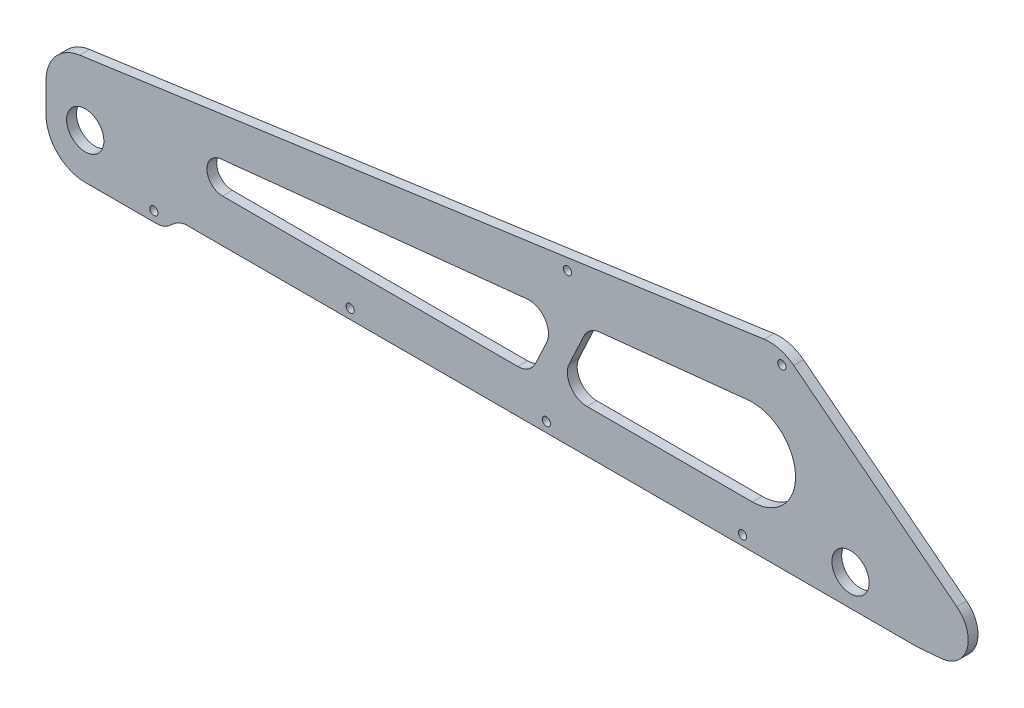
ISO-10303-21;
HEADER;
FILE_DESCRIPTION(('STEP AP214'),'2;1');
FILE_NAME('part.step','',(''),(''),'','','');
FILE_SCHEMA(('AUTOMOTIVE_DESIGN { 1 0 10303 214 1 1 1 1 }'));
ENDSEC;
DATA;
#1=APPLICATION_CONTEXT('core data for automotive mechanical design processes');
#2=APPLICATION_PROTOCOL_DEFINITION('international standard','automotive_design',2000,#1);
#3=PRODUCT_CONTEXT('',#1,'mechanical');
#4=PRODUCT('Part','Part','',(#3));
#5=PRODUCT_RELATED_PRODUCT_CATEGORY('part','',(#4));
#6=PRODUCT_DEFINITION_FORMATION('','',#4);
#7=PRODUCT_DEFINITION_CONTEXT('part definition',#1,'design');
#8=PRODUCT_DEFINITION('design','',#6,#7);
#9=PRODUCT_DEFINITION_SHAPE('','',#8);
#10=(LENGTH_UNIT() NAMED_UNIT(*) SI_UNIT(.MILLI.,.METRE.));
#11=(NAMED_UNIT(*) PLANE_ANGLE_UNIT() SI_UNIT($,.RADIAN.));
#12=(NAMED_UNIT(*) SI_UNIT($,.STERADIAN.) SOLID_ANGLE_UNIT());
#13=UNCERTAINTY_MEASURE_WITH_UNIT(LENGTH_MEASURE(1.E-05),#10,'distance_accuracy_value','');
#14=(GEOMETRIC_REPRESENTATION_CONTEXT(3) GLOBAL_UNCERTAINTY_ASSIGNED_CONTEXT((#13)) GLOBAL_UNIT_ASSIGNED_CONTEXT((#10,
#11,#12)) REPRESENTATION_CONTEXT('',''));
#15=CARTESIAN_POINT('',(0.,0.,0.));
#16=DIRECTION('',(0.,0.,1.));
#17=DIRECTION('',(1.,0.,0.));
#18=AXIS2_PLACEMENT_3D('',#15,#16,#17);
#19=CARTESIAN_POINT('',(-390.,12.,0.));
#20=DIRECTION('',(0.,0.,1.));
#21=DIRECTION('',(1.,0.,0.));
#22=AXIS2_PLACEMENT_3D('',#19,#20,#21);
#23=PLANE('',#22);
#24=CARTESIAN_POINT('',(-155.,-11.,0.));
#25=DIRECTION('',(0.,0.,-1.));
#26=DIRECTION('',(-1.,0.,0.));
#27=AXIS2_PLACEMENT_3D('',#24,#25,#26);
#28=CIRCLE('',#27,2.09999999999999);
#29=CARTESIAN_POINT('',(-157.1,-11.,0.));
#30=VERTEX_POINT('',#29);
#31=EDGE_CURVE('E326',#30,#30,#28,.F.);
#32=ORIENTED_EDGE('',*,*,#31,.T.);
#33=EDGE_LOOP('',(#32));
#34=FACE_BOUND('',#33,.T.);
#35=CARTESIAN_POINT('',(-355.,-18.,0.));
#36=DIRECTION('',(0.,0.,-1.));
#37=DIRECTION('',(-1.,0.,0.));
#38=AXIS2_PLACEMENT_3D('',#35,#36,#37);
#39=CIRCLE('',#38,2.09999999999999);
#40=CARTESIAN_POINT('',(-357.1,-18.,0.));
#41=VERTEX_POINT('',#40);
#42=EDGE_CURVE('E359',#41,#41,#39,.F.);
#43=ORIENTED_EDGE('',*,*,#42,.T.);
#44=EDGE_LOOP('',(#43));
#45=FACE_BOUND('',#44,.T.);
#46=CARTESIAN_POINT('',(-35.,74.,0.));
#47=DIRECTION('',(0.,0.,-1.));
#48=DIRECTION('',(-1.,0.,0.));
#49=AXIS2_PLACEMENT_3D('',#46,#47,#48);
#50=CIRCLE('',#49,2.1);
#51=CARTESIAN_POINT('',(-37.1,74.,0.));
#52=VERTEX_POINT('',#51);
#53=EDGE_CURVE('E329',#52,#52,#50,.F.);
#54=ORIENTED_EDGE('',*,*,#53,.T.);
#55=EDGE_LOOP('',(#54));
#56=FACE_BOUND('',#55,.T.);
#57=CARTESIAN_POINT('',(-390.,0.,0.));
#58=DIRECTION('',(0.,0.,-1.));
#59=DIRECTION('',(-1.,0.,0.));
#60=AXIS2_PLACEMENT_3D('',#57,#58,#59);
#61=CIRCLE('',#60,9.50000000000001);
#62=CARTESIAN_POINT('',(-399.5,0.,0.));
#63=VERTEX_POINT('',#62);
#64=EDGE_CURVE('E356',#63,#63,#61,.F.);
#65=ORIENTED_EDGE('',*,*,#64,.T.);
#66=EDGE_LOOP('',(#65));
#67=FACE_BOUND('',#66,.T.);
#68=CARTESIAN_POINT('',(-255.,-11.,0.));
#69=DIRECTION('',(0.,0.,-1.));
#70=DIRECTION('',(-1.,0.,0.));
#71=AXIS2_PLACEMENT_3D('',#68,#69,#70);
#72=CIRCLE('',#71,2.09999999999999);
#73=CARTESIAN_POINT('',(-257.1,-11.,0.));
#74=VERTEX_POINT('',#73);
#75=EDGE_CURVE('E332',#74,#74,#72,.F.);
#76=ORIENTED_EDGE('',*,*,#75,.T.);
#77=EDGE_LOOP('',(#76));
#78=FACE_BOUND('',#77,.T.);
#79=CARTESIAN_POINT('',(0.,0.,0.));
#80=DIRECTION('',(0.,0.,-1.));
#81=DIRECTION('',(-1.,0.,0.));
#82=AXIS2_PLACEMENT_3D('',#79,#80,#81);
#83=CIRCLE('',#82,9.5);
#84=CARTESIAN_POINT('',(-9.5,0.,0.));
#85=VERTEX_POINT('',#84);
#86=EDGE_CURVE('E353',#85,#85,#83,.F.);
#87=ORIENTED_EDGE('',*,*,#86,.T.);
#88=EDGE_LOOP('',(#87));
#89=FACE_BOUND('',#88,.T.);
#90=CARTESIAN_POINT('',(-144.229116997255,61.,0.));
#91=DIRECTION('',(0.,0.,-1.));
#92=DIRECTION('',(-1.,0.,0.));
#93=AXIS2_PLACEMENT_3D('',#90,#91,#92);
#94=CIRCLE('',#93,2.10000000000002);
#95=CARTESIAN_POINT('',(-146.329116997255,61.,0.));
#96=VERTEX_POINT('',#95);
#97=EDGE_CURVE('E207',#96,#96,#94,.F.);
#98=ORIENTED_EDGE('',*,*,#97,.T.);
#99=EDGE_LOOP('',(#98));
#100=FACE_BOUND('',#99,.T.);
#101=CARTESIAN_POINT('',(-55.,-11.,0.));
#102=DIRECTION('',(0.,0.,-1.));
#103=DIRECTION('',(-1.,0.,0.));
#104=AXIS2_PLACEMENT_3D('',#101,#102,#103);
#105=CIRCLE('',#104,2.1);
#106=CARTESIAN_POINT('',(-57.1,-11.,0.));
#107=VERTEX_POINT('',#106);
#108=EDGE_CURVE('E350',#107,#107,#105,.F.);
#109=ORIENTED_EDGE('',*,*,#108,.T.);
#110=EDGE_LOOP('',(#109));
#111=FACE_BOUND('',#110,.T.);
#112=DIRECTION('',(0.99026806874157,0.139173100960066,0.));
#113=VECTOR('',#112,1.);
#114=CARTESIAN_POINT('',(-44.0039791289545,80.8231210272953,0.));
#115=LINE('',#114,#113);
#116=CARTESIAN_POINT('',(-392.783462019201,31.8053613748314,0.));
#117=VERTEX_POINT('',#116);
#118=CARTESIAN_POINT('',(-44.0039791289545,80.8231210272953,0.));
#119=VERTEX_POINT('',#118);
#120=EDGE_CURVE('E204',#117,#119,#115,.T.);
#121=ORIENTED_EDGE('',*,*,#120,.T.);
#122=CARTESIAN_POINT('',(-41.2205171097532,61.017759652464,0.));
#123=DIRECTION('',(0.,0.,-1.));
#124=DIRECTION('',(-1.,0.,0.));
#125=AXIS2_PLACEMENT_3D('',#122,#123,#124);
#126=CIRCLE('',#125,20.);
#127=CARTESIAN_POINT('',(-28.90728760324,76.7779747245984,0.));
#128=VERTEX_POINT('',#127);
#129=EDGE_CURVE('E212',#128,#119,#126,.F.);
#130=ORIENTED_EDGE('',*,*,#129,.F.);
#131=DIRECTION('',(0.788010753606721,-0.615661475325659,0.));
#132=VECTOR('',#131,1.);
#133=CARTESIAN_POINT('',(54.2349221298849,11.8201613041008,0.));
#134=LINE('',#133,#132);
#135=CARTESIAN_POINT('',(54.2349221298849,11.8201613041008,0.));
#136=VERTEX_POINT('',#135);
#137=EDGE_CURVE('E209',#128,#136,#134,.T.);
#138=ORIENTED_EDGE('',*,*,#137,.T.);
#139=CARTESIAN_POINT('',(45.,0.,0.));
#140=DIRECTION('',(0.,0.,-1.));
#141=DIRECTION('',(-1.,0.,0.));
#142=AXIS2_PLACEMENT_3D('',#139,#140,#141);
#143=CIRCLE('',#142,15.);
#144=CARTESIAN_POINT('',(46.3073361412148,-14.9429204713762,0.));
#145=VERTEX_POINT('',#144);
#146=EDGE_CURVE('E217',#145,#136,#143,.F.);
#147=ORIENTED_EDGE('',*,*,#146,.F.);
#148=DIRECTION('',(-0.996194698091746,-0.0871557427476516,0.));
#149=VECTOR('',#148,1.);
#150=CARTESIAN_POINT('',(34.2248618408655,-16.,0.));
#151=LINE('',#150,#149);
#152=CARTESIAN_POINT('',(34.2248618408655,-16.,0.));
#153=VERTEX_POINT('',#152);
#154=EDGE_CURVE('E214',#145,#153,#151,.T.);
#155=ORIENTED_EDGE('',*,*,#154,.T.);
#156=DIRECTION('',(-1.,0.,0.));
#157=VECTOR('',#156,1.);
#158=CARTESIAN_POINT('',(34.2248618408655,-16.,0.));
#159=LINE('',#158,#157);
#160=CARTESIAN_POINT('',(-338.018022509179,-16.,0.));
#161=VERTEX_POINT('',#160);
#162=EDGE_CURVE('E221',#153,#161,#159,.T.);
#163=ORIENTED_EDGE('',*,*,#162,.T.);
#164=CARTESIAN_POINT('',(-338.018022509179,-26.,0.));
#165=DIRECTION('',(0.,0.,-1.));
#166=DIRECTION('',(-1.,0.,0.));
#167=AXIS2_PLACEMENT_3D('',#164,#165,#166);
#168=CIRCLE('',#167,10.);
#169=CARTESIAN_POINT('',(-344.445898606044,-18.3395555688103,0.));
#170=VERTEX_POINT('',#169);
#171=EDGE_CURVE('E341',#161,#170,#168,.F.);
#172=ORIENTED_EDGE('',*,*,#171,.T.);
#173=DIRECTION('',(-0.766044443118978,-0.64278760968654,0.));
#174=VECTOR('',#173,1.);
#175=CARTESIAN_POINT('',(-347.211826245797,-20.6604444311898,0.));
#176=LINE('',#175,#174);
#177=CARTESIAN_POINT('',(-347.211826245797,-20.6604444311898,0.));
#178=VERTEX_POINT('',#177);
#179=EDGE_CURVE('E227',#170,#178,#176,.T.);
#180=ORIENTED_EDGE('',*,*,#179,.T.);
#181=CARTESIAN_POINT('',(-353.639702342662,-13.,0.));
#182=DIRECTION('',(0.,0.,-1.));
#183=DIRECTION('',(-1.,0.,0.));
#184=AXIS2_PLACEMENT_3D('',#181,#182,#183);
#185=CIRCLE('',#184,10.);
#186=CARTESIAN_POINT('',(-353.639702342662,-23.,0.));
#187=VERTEX_POINT('',#186);
#188=EDGE_CURVE('E235',#187,#178,#185,.F.);
#189=ORIENTED_EDGE('',*,*,#188,.F.);
#190=DIRECTION('',(-1.,0.,0.));
#191=VECTOR('',#190,1.);
#192=CARTESIAN_POINT('',(-390.,-23.,0.));
#193=LINE('',#192,#191);
#194=CARTESIAN_POINT('',(-390.,-23.,0.));
#195=VERTEX_POINT('',#194);
#196=EDGE_CURVE('E232',#187,#195,#193,.T.);
#197=ORIENTED_EDGE('',*,*,#196,.T.);
#198=CARTESIAN_POINT('',(-390.,-3.,0.));
#199=DIRECTION('',(0.,0.,-1.));
#200=DIRECTION('',(-1.,0.,0.));
#201=AXIS2_PLACEMENT_3D('',#198,#199,#200);
#202=CIRCLE('',#201,20.);
#203=CARTESIAN_POINT('',(-410.,-3.,0.));
#204=VERTEX_POINT('',#203);
#205=EDGE_CURVE('E240',#204,#195,#202,.F.);
#206=ORIENTED_EDGE('',*,*,#205,.F.);
#207=DIRECTION('',(0.,1.,0.));
#208=VECTOR('',#207,1.);
#209=CARTESIAN_POINT('',(-410.,12.,0.));
#210=LINE('',#209,#208);
#211=CARTESIAN_POINT('',(-410.,12.,0.));
#212=VERTEX_POINT('',#211);
#213=EDGE_CURVE('E237',#204,#212,#210,.T.);
#214=ORIENTED_EDGE('',*,*,#213,.T.);
#215=CARTESIAN_POINT('',(-390.,12.,0.));
#216=DIRECTION('',(0.,0.,-1.));
#217=DIRECTION('',(-1.,0.,0.));
#218=AXIS2_PLACEMENT_3D('',#215,#216,#217);
#219=CIRCLE('',#218,20.);
#220=EDGE_CURVE('E348',#117,#212,#219,.F.);
#221=ORIENTED_EDGE('',*,*,#220,.F.);
#222=EDGE_LOOP('',(#121,#130,#138,#147,#155,#163,#172,#180,#189,#197,#206,#214,#221));
#223=FACE_BOUND('',#222,.T.);
#224=CARTESIAN_POINT('',(-320.,14.,0.));
#225=DIRECTION('',(0.,0.,1.));
#226=DIRECTION('',(1.,0.,0.));
#227=AXIS2_PLACEMENT_3D('',#224,#225,#226);
#228=CIRCLE('',#227,8.00000000000001);
#229=CARTESIAN_POINT('',(-320.827405056364,21.9570975155959,0.));
#230=VERTEX_POINT('',#229);
#231=CARTESIAN_POINT('',(-320.,5.99999999999996,0.));
#232=VERTEX_POINT('',#231);
#233=EDGE_CURVE('E189',#230,#232,#228,.T.);
#234=ORIENTED_EDGE('',*,*,#233,.T.);
#235=DIRECTION('',(1.,0.,0.));
#236=VECTOR('',#235,1.);
#237=CARTESIAN_POINT('',(-320.,5.99999999999996,0.));
#238=LINE('',#237,#236);
#239=CARTESIAN_POINT('',(-169.611237635625,5.99999999999996,0.));
#240=VERTEX_POINT('',#239);
#241=EDGE_CURVE('E242',#232,#240,#238,.T.);
#242=ORIENTED_EDGE('',*,*,#241,.T.);
#243=CARTESIAN_POINT('',(-169.611237635625,16.,0.));
#244=DIRECTION('',(0.,0.,1.));
#245=DIRECTION('',(1.,0.,0.));
#246=AXIS2_PLACEMENT_3D('',#243,#244,#245);
#247=CIRCLE('',#246,10.);
#248=CARTESIAN_POINT('',(-160.548159765258,11.773817382593,0.));
#249=VERTEX_POINT('',#248);
#250=EDGE_CURVE('E362',#240,#249,#247,.T.);
#251=ORIENTED_EDGE('',*,*,#250,.T.);
#252=DIRECTION('',(0.422618261740698,0.906307787036651,0.));
#253=VECTOR('',#252,1.);
#254=CARTESIAN_POINT('',(-160.548159765258,11.773817382593,0.));
#255=LINE('',#254,#253);
#256=CARTESIAN_POINT('',(-154.850047639105,23.9934582709677,0.));
#257=VERTEX_POINT('',#256);
#258=EDGE_CURVE('E246',#249,#257,#255,.T.);
#259=ORIENTED_EDGE('',*,*,#258,.T.);
#260=CARTESIAN_POINT('',(-163.913125509472,28.2196408883746,0.));
#261=DIRECTION('',(0.,0.,1.));
#262=DIRECTION('',(1.,0.,0.));
#263=AXIS2_PLACEMENT_3D('',#260,#261,#262);
#264=CIRCLE('',#263,9.99999999999998);
#265=CARTESIAN_POINT('',(-164.947381829927,38.1660127828695,0.));
#266=VERTEX_POINT('',#265);
#267=EDGE_CURVE('E249',#257,#266,#264,.T.);
#268=ORIENTED_EDGE('',*,*,#267,.T.);
#269=DIRECTION('',(-0.994637189449491,-0.103425632045529,0.));
#270=VECTOR('',#269,1.);
#271=CARTESIAN_POINT('',(-320.827405056364,21.9570975155959,0.));
#272=LINE('',#271,#270);
#273=EDGE_CURVE('E250',#266,#230,#272,.T.);
#274=ORIENTED_EDGE('',*,*,#273,.T.);
#275=EDGE_LOOP('',(#234,#242,#251,#259,#268,#274));
#276=FACE_BOUND('',#275,.T.);
#277=DIRECTION('',(1.,0.,0.));
#278=VECTOR('',#277,1.);
#279=CARTESIAN_POINT('',(-134.303144228825,5.99999999999996,0.));
#280=LINE('',#279,#278);
#281=CARTESIAN_POINT('',(-134.303144228825,5.99999999999997,0.));
#282=VERTEX_POINT('',#281);
#283=CARTESIAN_POINT('',(-50.,5.99999999999996,0.));
#284=VERTEX_POINT('',#283);
#285=EDGE_CURVE('E191',#282,#284,#280,.T.);
#286=ORIENTED_EDGE('',*,*,#285,.T.);
#287=CARTESIAN_POINT('',(-50.,28.,0.));
#288=DIRECTION('',(0.,0.,1.));
#289=DIRECTION('',(1.,0.,0.));
#290=AXIS2_PLACEMENT_3D('',#287,#288,#289);
#291=CIRCLE('',#290,22.);
#292=CARTESIAN_POINT('',(-52.2753639050016,49.8820181678887,0.));
#293=VERTEX_POINT('',#292);
#294=EDGE_CURVE('E182',#284,#293,#291,.T.);
#295=ORIENTED_EDGE('',*,*,#294,.T.);
#296=DIRECTION('',(-0.994637189449491,-0.103425632045529,0.));
#297=VECTOR('',#296,1.);
#298=CARTESIAN_POINT('',(-127.84001930833,42.0245578514115,0.));
#299=LINE('',#298,#297);
#300=CARTESIAN_POINT('',(-127.84001930833,42.0245578514115,0.));
#301=VERTEX_POINT('',#300);
#302=EDGE_CURVE('E253',#293,#301,#299,.T.);
#303=ORIENTED_EDGE('',*,*,#302,.T.);
#304=CARTESIAN_POINT('',(-126.805762987875,32.0781859569166,0.));
#305=DIRECTION('',(0.,0.,1.));
#306=DIRECTION('',(1.,0.,0.));
#307=AXIS2_PLACEMENT_3D('',#304,#305,#306);
#308=CIRCLE('',#307,10.);
#309=CARTESIAN_POINT('',(-135.868840858241,36.3043685743236,0.));
#310=VERTEX_POINT('',#309);
#311=EDGE_CURVE('E367',#301,#310,#308,.T.);
#312=ORIENTED_EDGE('',*,*,#311,.T.);
#313=DIRECTION('',(-0.422618261740698,-0.906307787036651,0.));
#314=VECTOR('',#313,1.);
#315=CARTESIAN_POINT('',(-143.366222099192,20.2261826174069,0.));
#316=LINE('',#315,#314);
#317=CARTESIAN_POINT('',(-143.366222099192,20.2261826174069,0.));
#318=VERTEX_POINT('',#317);
#319=EDGE_CURVE('E257',#310,#318,#316,.T.);
#320=ORIENTED_EDGE('',*,*,#319,.T.);
#321=CARTESIAN_POINT('',(-134.303144228825,16.,0.));
#322=DIRECTION('',(0.,0.,1.));
#323=DIRECTION('',(1.,0.,0.));
#324=AXIS2_PLACEMENT_3D('',#321,#322,#323);
#325=CIRCLE('',#324,9.99999999999999);
#326=EDGE_CURVE('E19',#318,#282,#325,.T.);
#327=ORIENTED_EDGE('',*,*,#326,.T.);
#328=EDGE_LOOP('',(#286,#295,#303,#312,#320,#327));
#329=FACE_BOUND('',#328,.T.);
#330=ADVANCED_FACE('F16',(#34,#45,#56,#67,#78,#89,#100,#111,#223,#276,#329),#23,.F.);
#331=CARTESIAN_POINT('',(-134.303144228825,5.99999999999996,0.));
#332=DIRECTION('',(0.,-1.,0.));
#333=DIRECTION('',(0.,0.,-1.));
#334=AXIS2_PLACEMENT_3D('',#331,#332,#333);
#335=PLANE('',#334);
#336=DIRECTION('',(0.,0.,-1.));
#337=VECTOR('',#336,1.);
#338=CARTESIAN_POINT('',(-50.,5.99999999999996,0.));
#339=LINE('',#338,#337);
#340=CARTESIAN_POINT('',(-50.,5.99999999999996,5.));
#341=VERTEX_POINT('',#340);
#342=EDGE_CURVE('E185',#284,#341,#339,.F.);
#343=ORIENTED_EDGE('',*,*,#342,.F.);
#344=ORIENTED_EDGE('',*,*,#285,.F.);
#345=DIRECTION('',(0.,0.,1.));
#346=VECTOR('',#345,1.);
#347=CARTESIAN_POINT('',(-134.303144228825,5.99999999999997,0.));
#348=LINE('',#347,#346);
#349=CARTESIAN_POINT('',(-134.303144228825,5.99999999999997,5.));
#350=VERTEX_POINT('',#349);
#351=EDGE_CURVE('E200',#282,#350,#348,.T.);
#352=ORIENTED_EDGE('',*,*,#351,.T.);
#353=DIRECTION('',(1.,0.,0.));
#354=VECTOR('',#353,1.);
#355=CARTESIAN_POINT('',(-390.,5.99999999999996,5.));
#356=LINE('',#355,#354);
#357=EDGE_CURVE('E197',#341,#350,#356,.F.);
#358=ORIENTED_EDGE('',*,*,#357,.F.);
#359=EDGE_LOOP('',(#343,#344,#352,#358));
#360=FACE_BOUND('',#359,.T.);
#361=ADVANCED_FACE('F195',(#360),#335,.F.);
#362=CARTESIAN_POINT('',(-134.303144228825,16.,0.));
#363=DIRECTION('',(0.,0.,1.));
#364=DIRECTION('',(1.,0.,0.));
#365=AXIS2_PLACEMENT_3D('',#362,#363,#364);
#366=CYLINDRICAL_SURFACE('',#365,9.99999999999999);
#367=ORIENTED_EDGE('',*,*,#351,.F.);
#368=ORIENTED_EDGE('',*,*,#326,.F.);
#369=DIRECTION('',(0.,0.,1.));
#370=VECTOR('',#369,1.);
#371=CARTESIAN_POINT('',(-143.366222099192,20.2261826174069,0.));
#372=LINE('',#371,#370);
#373=CARTESIAN_POINT('',(-143.366222099192,20.2261826174069,5.));
#374=VERTEX_POINT('',#373);
#375=EDGE_CURVE('E258',#318,#374,#372,.T.);
#376=ORIENTED_EDGE('',*,*,#375,.T.);
#377=CARTESIAN_POINT('',(-134.303144228825,16.,5.));
#378=DIRECTION('',(0.,0.,1.));
#379=DIRECTION('',(1.,0.,0.));
#380=AXIS2_PLACEMENT_3D('',#377,#378,#379);
#381=CIRCLE('',#380,9.99999999999999);
#382=EDGE_CURVE('E321',#350,#374,#381,.F.);
#383=ORIENTED_EDGE('',*,*,#382,.F.);
#384=EDGE_LOOP('',(#367,#368,#376,#383));
#385=FACE_BOUND('',#384,.T.);
#386=ADVANCED_FACE('F592',(#385),#366,.F.);
#387=CARTESIAN_POINT('',(-143.366222099192,20.2261826174069,0.));
#388=DIRECTION('',(-0.906307787036651,0.422618261740698,0.));
#389=DIRECTION('',(-0.422618261740698,-0.906307787036651,0.));
#390=AXIS2_PLACEMENT_3D('',#387,#388,#389);
#391=PLANE('',#390);
#392=ORIENTED_EDGE('',*,*,#375,.F.);
#393=ORIENTED_EDGE('',*,*,#319,.F.);
#394=DIRECTION('',(0.,0.,1.));
#395=VECTOR('',#394,1.);
#396=CARTESIAN_POINT('',(-135.868840858241,36.3043685743236,0.));
#397=LINE('',#396,#395);
#398=CARTESIAN_POINT('',(-135.868840858241,36.3043685743236,5.));
#399=VERTEX_POINT('',#398);
#400=EDGE_CURVE('E256',#310,#399,#397,.T.);
#401=ORIENTED_EDGE('',*,*,#400,.T.);
#402=DIRECTION('',(0.422618261740698,0.906307787036651,0.));
#403=VECTOR('',#402,1.);
#404=CARTESIAN_POINT('',(-143.366222099192,20.2261826174069,5.));
#405=LINE('',#404,#403);
#406=EDGE_CURVE('E320',#374,#399,#405,.T.);
#407=ORIENTED_EDGE('',*,*,#406,.F.);
#408=EDGE_LOOP('',(#392,#393,#401,#407));
#409=FACE_BOUND('',#408,.T.);
#410=ADVANCED_FACE('F588',(#409),#391,.F.);
#411=CARTESIAN_POINT('',(-126.805762987875,32.0781859569166,0.));
#412=DIRECTION('',(0.,0.,1.));
#413=DIRECTION('',(1.,0.,0.));
#414=AXIS2_PLACEMENT_3D('',#411,#412,#413);
#415=CYLINDRICAL_SURFACE('',#414,10.);
#416=ORIENTED_EDGE('',*,*,#400,.F.);
#417=ORIENTED_EDGE('',*,*,#311,.F.);
#418=DIRECTION('',(0.,0.,1.));
#419=VECTOR('',#418,1.);
#420=CARTESIAN_POINT('',(-127.84001930833,42.0245578514115,0.));
#421=LINE('',#420,#419);
#422=CARTESIAN_POINT('',(-127.84001930833,42.0245578514115,5.));
#423=VERTEX_POINT('',#422);
#424=EDGE_CURVE('E255',#301,#423,#421,.T.);
#425=ORIENTED_EDGE('',*,*,#424,.T.);
#426=CARTESIAN_POINT('',(-126.805762987875,32.0781859569166,5.));
#427=DIRECTION('',(0.,0.,1.));
#428=DIRECTION('',(1.,0.,0.));
#429=AXIS2_PLACEMENT_3D('',#426,#427,#428);
#430=CIRCLE('',#429,10.);
#431=EDGE_CURVE('E317',#399,#423,#430,.F.);
#432=ORIENTED_EDGE('',*,*,#431,.F.);
#433=EDGE_LOOP('',(#416,#417,#425,#432));
#434=FACE_BOUND('',#433,.T.);
#435=ADVANCED_FACE('F584',(#434),#415,.F.);
#436=CARTESIAN_POINT('',(-127.84001930833,42.0245578514115,0.));
#437=DIRECTION('',(-0.103425632045529,0.994637189449491,0.));
#438=DIRECTION('',(-0.994637189449491,-0.103425632045529,0.));
#439=AXIS2_PLACEMENT_3D('',#436,#437,#438);
#440=PLANE('',#439);
#441=ORIENTED_EDGE('',*,*,#424,.F.);
#442=ORIENTED_EDGE('',*,*,#302,.F.);
#443=DIRECTION('',(0.,0.,1.));
#444=VECTOR('',#443,1.);
#445=CARTESIAN_POINT('',(-52.2753639050016,49.8820181678888,0.));
#446=LINE('',#445,#444);
#447=CARTESIAN_POINT('',(-52.2753639050016,49.8820181678888,5.));
#448=VERTEX_POINT('',#447);
#449=EDGE_CURVE('E188',#293,#448,#446,.T.);
#450=ORIENTED_EDGE('',*,*,#449,.T.);
#451=DIRECTION('',(0.994637189449491,0.103425632045529,0.));
#452=VECTOR('',#451,1.);
#453=CARTESIAN_POINT('',(-127.84001930833,42.0245578514115,5.));
#454=LINE('',#453,#452);
#455=EDGE_CURVE('E316',#423,#448,#454,.T.);
#456=ORIENTED_EDGE('',*,*,#455,.F.);
#457=EDGE_LOOP('',(#441,#442,#450,#456));
#458=FACE_BOUND('',#457,.T.);
#459=ADVANCED_FACE('F581',(#458),#440,.F.);
#460=CARTESIAN_POINT('',(-50.,28.,0.));
#461=DIRECTION('',(0.,0.,1.));
#462=DIRECTION('',(1.,0.,0.));
#463=AXIS2_PLACEMENT_3D('',#460,#461,#462);
#464=CYLINDRICAL_SURFACE('',#463,22.);
#465=ORIENTED_EDGE('',*,*,#294,.F.);
#466=ORIENTED_EDGE('',*,*,#342,.T.);
#467=CARTESIAN_POINT('',(-50.,28.,5.));
#468=DIRECTION('',(0.,0.,1.));
#469=DIRECTION('',(1.,0.,0.));
#470=AXIS2_PLACEMENT_3D('',#467,#468,#469);
#471=CIRCLE('',#470,22.);
#472=EDGE_CURVE('E324',#448,#341,#471,.F.);
#473=ORIENTED_EDGE('',*,*,#472,.F.);
#474=ORIENTED_EDGE('',*,*,#449,.F.);
#475=EDGE_LOOP('',(#465,#466,#473,#474));
#476=FACE_BOUND('',#475,.T.);
#477=ADVANCED_FACE('F183',(#476),#464,.F.);
#478=CARTESIAN_POINT('',(-320.,14.,0.));
#479=DIRECTION('',(0.,0.,1.));
#480=DIRECTION('',(1.,0.,0.));
#481=AXIS2_PLACEMENT_3D('',#478,#479,#480);
#482=CYLINDRICAL_SURFACE('',#481,8.00000000000001);
#483=DIRECTION('',(0.,0.,-1.));
#484=VECTOR('',#483,1.);
#485=CARTESIAN_POINT('',(-320.,5.99999999999996,0.));
#486=LINE('',#485,#484);
#487=CARTESIAN_POINT('',(-320.,5.99999999999996,5.));
#488=VERTEX_POINT('',#487);
#489=EDGE_CURVE('E245',#488,#232,#486,.T.);
#490=ORIENTED_EDGE('',*,*,#489,.T.);
#491=ORIENTED_EDGE('',*,*,#233,.F.);
#492=DIRECTION('',(0.,0.,1.));
#493=VECTOR('',#492,1.);
#494=CARTESIAN_POINT('',(-320.827405056364,21.9570975155959,0.));
#495=LINE('',#494,#493);
#496=CARTESIAN_POINT('',(-320.827405056364,21.9570975155959,5.));
#497=VERTEX_POINT('',#496);
#498=EDGE_CURVE('E252',#230,#497,#495,.T.);
#499=ORIENTED_EDGE('',*,*,#498,.T.);
#500=CARTESIAN_POINT('',(-320.,14.,5.));
#501=DIRECTION('',(0.,0.,1.));
#502=DIRECTION('',(1.,0.,0.));
#503=AXIS2_PLACEMENT_3D('',#500,#501,#502);
#504=CIRCLE('',#503,8.00000000000001);
#505=EDGE_CURVE('E313',#488,#497,#504,.F.);
#506=ORIENTED_EDGE('',*,*,#505,.F.);
#507=EDGE_LOOP('',(#490,#491,#499,#506));
#508=FACE_BOUND('',#507,.T.);
#509=ADVANCED_FACE('F574',(#508),#482,.F.);
#510=CARTESIAN_POINT('',(-320.827405056364,21.9570975155959,0.));
#511=DIRECTION('',(-0.103425632045529,0.994637189449491,0.));
#512=DIRECTION('',(-0.994637189449491,-0.103425632045529,0.));
#513=AXIS2_PLACEMENT_3D('',#510,#511,#512);
#514=PLANE('',#513);
#515=ORIENTED_EDGE('',*,*,#498,.F.);
#516=ORIENTED_EDGE('',*,*,#273,.F.);
#517=DIRECTION('',(0.,0.,1.));
#518=VECTOR('',#517,1.);
#519=CARTESIAN_POINT('',(-164.947381829927,38.1660127828695,0.));
#520=LINE('',#519,#518);
#521=CARTESIAN_POINT('',(-164.947381829927,38.1660127828695,5.));
#522=VERTEX_POINT('',#521);
#523=EDGE_CURVE('E366',#266,#522,#520,.T.);
#524=ORIENTED_EDGE('',*,*,#523,.T.);
#525=DIRECTION('',(0.994637189449491,0.103425632045529,0.));
#526=VECTOR('',#525,1.);
#527=CARTESIAN_POINT('',(-320.827405056364,21.9570975155959,5.));
#528=LINE('',#527,#526);
#529=EDGE_CURVE('E312',#497,#522,#528,.T.);
#530=ORIENTED_EDGE('',*,*,#529,.F.);
#531=EDGE_LOOP('',(#515,#516,#524,#530));
#532=FACE_BOUND('',#531,.T.);
#533=ADVANCED_FACE('F570',(#532),#514,.F.);
#534=CARTESIAN_POINT('',(-163.913125509472,28.2196408883746,0.));
#535=DIRECTION('',(0.,0.,1.));
#536=DIRECTION('',(1.,0.,0.));
#537=AXIS2_PLACEMENT_3D('',#534,#535,#536);
#538=CYLINDRICAL_SURFACE('',#537,9.99999999999998);
#539=ORIENTED_EDGE('',*,*,#267,.F.);
#540=DIRECTION('',(0.,0.,1.));
#541=VECTOR('',#540,1.);
#542=CARTESIAN_POINT('',(-154.850047639105,23.9934582709677,0.));
#543=LINE('',#542,#541);
#544=CARTESIAN_POINT('',(-154.850047639105,23.9934582709677,5.));
#545=VERTEX_POINT('',#544);
#546=EDGE_CURVE('E248',#257,#545,#543,.T.);
#547=ORIENTED_EDGE('',*,*,#546,.T.);
#548=CARTESIAN_POINT('',(-163.913125509472,28.2196408883746,5.));
#549=DIRECTION('',(0.,0.,1.));
#550=DIRECTION('',(1.,0.,0.));
#551=AXIS2_PLACEMENT_3D('',#548,#549,#550);
#552=CIRCLE('',#551,9.99999999999998);
#553=EDGE_CURVE('E310',#522,#545,#552,.F.);
#554=ORIENTED_EDGE('',*,*,#553,.F.);
#555=ORIENTED_EDGE('',*,*,#523,.F.);
#556=EDGE_LOOP('',(#539,#547,#554,#555));
#557=FACE_BOUND('',#556,.T.);
#558=ADVANCED_FACE('F566',(#557),#538,.F.);
#559=CARTESIAN_POINT('',(-160.548159765258,11.773817382593,0.));
#560=DIRECTION('',(0.906307787036651,-0.422618261740698,0.));
#561=DIRECTION('',(0.422618261740698,0.906307787036651,0.));
#562=AXIS2_PLACEMENT_3D('',#559,#560,#561);
#563=PLANE('',#562);
#564=ORIENTED_EDGE('',*,*,#546,.F.);
#565=ORIENTED_EDGE('',*,*,#258,.F.);
#566=DIRECTION('',(0.,0.,1.));
#567=VECTOR('',#566,1.);
#568=CARTESIAN_POINT('',(-160.548159765258,11.773817382593,0.));
#569=LINE('',#568,#567);
#570=CARTESIAN_POINT('',(-160.548159765258,11.773817382593,5.));
#571=VERTEX_POINT('',#570);
#572=EDGE_CURVE('E364',#249,#571,#569,.T.);
#573=ORIENTED_EDGE('',*,*,#572,.T.);
#574=DIRECTION('',(-0.422618261740696,-0.906307787036652,0.));
#575=VECTOR('',#574,1.);
#576=CARTESIAN_POINT('',(-154.850047639105,23.9934582709677,5.));
#577=LINE('',#576,#575);
#578=EDGE_CURVE('E309',#545,#571,#577,.T.);
#579=ORIENTED_EDGE('',*,*,#578,.F.);
#580=EDGE_LOOP('',(#564,#565,#573,#579));
#581=FACE_BOUND('',#580,.T.);
#582=ADVANCED_FACE('F562',(#581),#563,.F.);
#583=CARTESIAN_POINT('',(-169.611237635625,16.,0.));
#584=DIRECTION('',(0.,0.,1.));
#585=DIRECTION('',(1.,0.,0.));
#586=AXIS2_PLACEMENT_3D('',#583,#584,#585);
#587=CYLINDRICAL_SURFACE('',#586,10.);
#588=ORIENTED_EDGE('',*,*,#572,.F.);
#589=ORIENTED_EDGE('',*,*,#250,.F.);
#590=DIRECTION('',(0.,0.,-1.));
#591=VECTOR('',#590,1.);
#592=CARTESIAN_POINT('',(-169.611237635625,5.99999999999996,0.));
#593=LINE('',#592,#591);
#594=CARTESIAN_POINT('',(-169.611237635625,5.99999999999996,5.));
#595=VERTEX_POINT('',#594);
#596=EDGE_CURVE('E244',#240,#595,#593,.F.);
#597=ORIENTED_EDGE('',*,*,#596,.T.);
#598=CARTESIAN_POINT('',(-169.611237635625,16.,5.));
#599=DIRECTION('',(0.,0.,1.));
#600=DIRECTION('',(1.,0.,0.));
#601=AXIS2_PLACEMENT_3D('',#598,#599,#600);
#602=CIRCLE('',#601,10.);
#603=EDGE_CURVE('E306',#571,#595,#602,.F.);
#604=ORIENTED_EDGE('',*,*,#603,.F.);
#605=EDGE_LOOP('',(#588,#589,#597,#604));
#606=FACE_BOUND('',#605,.T.);
#607=ADVANCED_FACE('F558',(#606),#587,.F.);
#608=CARTESIAN_POINT('',(-320.,5.99999999999996,0.));
#609=DIRECTION('',(0.,-1.,0.));
#610=DIRECTION('',(0.,0.,-1.));
#611=AXIS2_PLACEMENT_3D('',#608,#609,#610);
#612=PLANE('',#611);
#613=ORIENTED_EDGE('',*,*,#596,.F.);
#614=ORIENTED_EDGE('',*,*,#241,.F.);
#615=ORIENTED_EDGE('',*,*,#489,.F.);
#616=DIRECTION('',(1.,0.,0.));
#617=VECTOR('',#616,1.);
#618=CARTESIAN_POINT('',(-390.,5.99999999999996,5.));
#619=LINE('',#618,#617);
#620=EDGE_CURVE('E305',#595,#488,#619,.F.);
#621=ORIENTED_EDGE('',*,*,#620,.F.);
#622=EDGE_LOOP('',(#613,#614,#615,#621));
#623=FACE_BOUND('',#622,.T.);
#624=ADVANCED_FACE('F554',(#623),#612,.F.);
#625=CARTESIAN_POINT('',(-355.,-18.,5.));
#626=DIRECTION('',(0.,0.,-1.));
#627=DIRECTION('',(-1.,0.,0.));
#628=AXIS2_PLACEMENT_3D('',#625,#626,#627);
#629=CYLINDRICAL_SURFACE('',#628,2.09999999999999);
#630=CARTESIAN_POINT('',(-355.,-18.,5.));
#631=DIRECTION('',(0.,0.,-1.));
#632=DIRECTION('',(-1.,0.,0.));
#633=AXIS2_PLACEMENT_3D('',#630,#631,#632);
#634=CIRCLE('',#633,2.09999999999999);
#635=CARTESIAN_POINT('',(-357.1,-18.,5.));
#636=VERTEX_POINT('',#635);
#637=EDGE_CURVE('E302',#636,#636,#634,.T.);
#638=ORIENTED_EDGE('',*,*,#637,.F.);
#639=EDGE_LOOP('',(#638));
#640=FACE_BOUND('',#639,.T.);
#641=ORIENTED_EDGE('',*,*,#42,.F.);
#642=EDGE_LOOP('',(#641));
#643=FACE_BOUND('',#642,.T.);
#644=ADVANCED_FACE('F550',(#640,#643),#629,.F.);
#645=CARTESIAN_POINT('',(-390.,0.,5.));
#646=DIRECTION('',(0.,0.,-1.));
#647=DIRECTION('',(-1.,0.,0.));
#648=AXIS2_PLACEMENT_3D('',#645,#646,#647);
#649=CYLINDRICAL_SURFACE('',#648,9.50000000000001);
#650=CARTESIAN_POINT('',(-390.,0.,5.));
#651=DIRECTION('',(0.,0.,-1.));
#652=DIRECTION('',(-1.,0.,0.));
#653=AXIS2_PLACEMENT_3D('',#650,#651,#652);
#654=CIRCLE('',#653,9.50000000000001);
#655=CARTESIAN_POINT('',(-399.5,0.,5.));
#656=VERTEX_POINT('',#655);
#657=EDGE_CURVE('E299',#656,#656,#654,.T.);
#658=ORIENTED_EDGE('',*,*,#657,.F.);
#659=EDGE_LOOP('',(#658));
#660=FACE_BOUND('',#659,.T.);
#661=ORIENTED_EDGE('',*,*,#64,.F.);
#662=EDGE_LOOP('',(#661));
#663=FACE_BOUND('',#662,.T.);
#664=ADVANCED_FACE('F542',(#660,#663),#649,.F.);
#665=CARTESIAN_POINT('',(0.,0.,5.));
#666=DIRECTION('',(0.,0.,-1.));
#667=DIRECTION('',(-1.,0.,0.));
#668=AXIS2_PLACEMENT_3D('',#665,#666,#667);
#669=CYLINDRICAL_SURFACE('',#668,9.5);
#670=CARTESIAN_POINT('',(0.,0.,5.));
#671=DIRECTION('',(0.,0.,-1.));
#672=DIRECTION('',(-1.,0.,0.));
#673=AXIS2_PLACEMENT_3D('',#670,#671,#672);
#674=CIRCLE('',#673,9.5);
#675=CARTESIAN_POINT('',(-9.5,0.,5.));
#676=VERTEX_POINT('',#675);
#677=EDGE_CURVE('E296',#676,#676,#674,.T.);
#678=ORIENTED_EDGE('',*,*,#677,.F.);
#679=EDGE_LOOP('',(#678));
#680=FACE_BOUND('',#679,.T.);
#681=ORIENTED_EDGE('',*,*,#86,.F.);
#682=EDGE_LOOP('',(#681));
#683=FACE_BOUND('',#682,.T.);
#684=ADVANCED_FACE('F534',(#680,#683),#669,.F.);
#685=CARTESIAN_POINT('',(-55.,-11.,5.));
#686=DIRECTION('',(0.,0.,-1.));
#687=DIRECTION('',(-1.,0.,0.));
#688=AXIS2_PLACEMENT_3D('',#685,#686,#687);
#689=CYLINDRICAL_SURFACE('',#688,2.1);
#690=CARTESIAN_POINT('',(-55.,-11.,5.));
#691=DIRECTION('',(0.,0.,-1.));
#692=DIRECTION('',(-1.,0.,0.));
#693=AXIS2_PLACEMENT_3D('',#690,#691,#692);
#694=CIRCLE('',#693,2.1);
#695=CARTESIAN_POINT('',(-57.1,-11.,5.));
#696=VERTEX_POINT('',#695);
#697=EDGE_CURVE('E293',#696,#696,#694,.T.);
#698=ORIENTED_EDGE('',*,*,#697,.F.);
#699=EDGE_LOOP('',(#698));
#700=FACE_BOUND('',#699,.T.);
#701=ORIENTED_EDGE('',*,*,#108,.F.);
#702=EDGE_LOOP('',(#701));
#703=FACE_BOUND('',#702,.T.);
#704=ADVANCED_FACE('F532',(#700,#703),#689,.F.);
#705=CARTESIAN_POINT('',(-390.,12.,5.));
#706=DIRECTION('',(0.,0.,-1.));
#707=DIRECTION('',(-1.,0.,0.));
#708=AXIS2_PLACEMENT_3D('',#705,#706,#707);
#709=CYLINDRICAL_SURFACE('',#708,20.);
#710=CARTESIAN_POINT('',(-390.,12.,5.));
#711=DIRECTION('',(0.,0.,-1.));
#712=DIRECTION('',(-1.,0.,0.));
#713=AXIS2_PLACEMENT_3D('',#710,#711,#712);
#714=CIRCLE('',#713,20.);
#715=CARTESIAN_POINT('',(-392.783462019201,31.8053613748314,5.));
#716=VERTEX_POINT('',#715);
#717=CARTESIAN_POINT('',(-410.,12.,5.));
#718=VERTEX_POINT('',#717);
#719=EDGE_CURVE('E290',#716,#718,#714,.F.);
#720=ORIENTED_EDGE('',*,*,#719,.F.);
#721=DIRECTION('',(0.,0.,1.));
#722=VECTOR('',#721,1.);
#723=CARTESIAN_POINT('',(-392.783462019201,31.8053613748314,5.));
#724=LINE('',#723,#722);
#725=EDGE_CURVE('E208',#716,#117,#724,.F.);
#726=ORIENTED_EDGE('',*,*,#725,.T.);
#727=ORIENTED_EDGE('',*,*,#220,.T.);
#728=DIRECTION('',(0.,0.,-1.));
#729=VECTOR('',#728,1.);
#730=CARTESIAN_POINT('',(-410.,12.,5.));
#731=LINE('',#730,#729);
#732=EDGE_CURVE('E241',#212,#718,#731,.F.);
#733=ORIENTED_EDGE('',*,*,#732,.T.);
#734=EDGE_LOOP('',(#720,#726,#727,#733));
#735=FACE_BOUND('',#734,.T.);
#736=ADVANCED_FACE('F443',(#735),#709,.T.);
#737=CARTESIAN_POINT('',(-410.,12.,5.));
#738=DIRECTION('',(1.,0.,0.));
#739=DIRECTION('',(0.,0.,-1.));
#740=AXIS2_PLACEMENT_3D('',#737,#738,#739);
#741=PLANE('',#740);
#742=DIRECTION('',(0.,0.,-1.));
#743=VECTOR('',#742,1.);
#744=CARTESIAN_POINT('',(-410.,-3.,5.));
#745=LINE('',#744,#743);
#746=CARTESIAN_POINT('',(-410.,-3.,5.));
#747=VERTEX_POINT('',#746);
#748=EDGE_CURVE('E347',#747,#204,#745,.T.);
#749=ORIENTED_EDGE('',*,*,#748,.F.);
#750=DIRECTION('',(0.,1.,0.));
#751=VECTOR('',#750,1.);
#752=CARTESIAN_POINT('',(-410.,12.,5.));
#753=LINE('',#752,#751);
#754=EDGE_CURVE('E289',#718,#747,#753,.F.);
#755=ORIENTED_EDGE('',*,*,#754,.F.);
#756=ORIENTED_EDGE('',*,*,#732,.F.);
#757=ORIENTED_EDGE('',*,*,#213,.F.);
#758=EDGE_LOOP('',(#749,#755,#756,#757));
#759=FACE_BOUND('',#758,.T.);
#760=ADVANCED_FACE('F448',(#759),#741,.F.);
#761=CARTESIAN_POINT('',(-390.,-3.,5.));
#762=DIRECTION('',(0.,0.,-1.));
#763=DIRECTION('',(-1.,0.,0.));
#764=AXIS2_PLACEMENT_3D('',#761,#762,#763);
#765=CYLINDRICAL_SURFACE('',#764,20.);
#766=CARTESIAN_POINT('',(-390.,-3.,5.));
#767=DIRECTION('',(0.,0.,-1.));
#768=DIRECTION('',(-1.,0.,0.));
#769=AXIS2_PLACEMENT_3D('',#766,#767,#768);
#770=CIRCLE('',#769,20.);
#771=CARTESIAN_POINT('',(-390.,-23.,5.));
#772=VERTEX_POINT('',#771);
#773=EDGE_CURVE('E286',#747,#772,#770,.F.);
#774=ORIENTED_EDGE('',*,*,#773,.F.);
#775=ORIENTED_EDGE('',*,*,#748,.T.);
#776=ORIENTED_EDGE('',*,*,#205,.T.);
#777=DIRECTION('',(0.,0.,1.));
#778=VECTOR('',#777,1.);
#779=CARTESIAN_POINT('',(-390.,-23.,5.));
#780=LINE('',#779,#778);
#781=EDGE_CURVE('E236',#195,#772,#780,.T.);
#782=ORIENTED_EDGE('',*,*,#781,.T.);
#783=EDGE_LOOP('',(#774,#775,#776,#782));
#784=FACE_BOUND('',#783,.T.);
#785=ADVANCED_FACE('F452',(#784),#765,.T.);
#786=CARTESIAN_POINT('',(-390.,-23.,5.));
#787=DIRECTION('',(0.,1.,0.));
#788=DIRECTION('',(-1.,0.,0.));
#789=AXIS2_PLACEMENT_3D('',#786,#787,#788);
#790=PLANE('',#789);
#791=DIRECTION('',(0.,0.,-1.));
#792=VECTOR('',#791,1.);
#793=CARTESIAN_POINT('',(-353.639702342662,-23.,5.));
#794=LINE('',#793,#792);
#795=CARTESIAN_POINT('',(-353.639702342662,-23.,5.));
#796=VERTEX_POINT('',#795);
#797=EDGE_CURVE('E345',#796,#187,#794,.T.);
#798=ORIENTED_EDGE('',*,*,#797,.F.);
#799=DIRECTION('',(1.,0.,0.));
#800=VECTOR('',#799,1.);
#801=CARTESIAN_POINT('',(-390.,-23.,5.));
#802=LINE('',#801,#800);
#803=EDGE_CURVE('E285',#772,#796,#802,.T.);
#804=ORIENTED_EDGE('',*,*,#803,.F.);
#805=ORIENTED_EDGE('',*,*,#781,.F.);
#806=ORIENTED_EDGE('',*,*,#196,.F.);
#807=EDGE_LOOP('',(#798,#804,#805,#806));
#808=FACE_BOUND('',#807,.T.);
#809=ADVANCED_FACE('F456',(#808),#790,.F.);
#810=CARTESIAN_POINT('',(-353.639702342662,-13.,5.));
#811=DIRECTION('',(0.,0.,-1.));
#812=DIRECTION('',(-1.,0.,0.));
#813=AXIS2_PLACEMENT_3D('',#810,#811,#812);
#814=CYLINDRICAL_SURFACE('',#813,10.);
#815=CARTESIAN_POINT('',(-353.639702342662,-13.,5.));
#816=DIRECTION('',(0.,0.,-1.));
#817=DIRECTION('',(-1.,0.,0.));
#818=AXIS2_PLACEMENT_3D('',#815,#816,#817);
#819=CIRCLE('',#818,10.);
#820=CARTESIAN_POINT('',(-347.211826245797,-20.6604444311898,5.));
#821=VERTEX_POINT('',#820);
#822=EDGE_CURVE('E282',#796,#821,#819,.F.);
#823=ORIENTED_EDGE('',*,*,#822,.F.);
#824=ORIENTED_EDGE('',*,*,#797,.T.);
#825=ORIENTED_EDGE('',*,*,#188,.T.);
#826=DIRECTION('',(0.,0.,1.));
#827=VECTOR('',#826,1.);
#828=CARTESIAN_POINT('',(-347.211826245797,-20.6604444311898,5.));
#829=LINE('',#828,#827);
#830=EDGE_CURVE('E231',#178,#821,#829,.T.);
#831=ORIENTED_EDGE('',*,*,#830,.T.);
#832=EDGE_LOOP('',(#823,#824,#825,#831));
#833=FACE_BOUND('',#832,.T.);
#834=ADVANCED_FACE('F459',(#833),#814,.T.);
#835=CARTESIAN_POINT('',(-347.211826245797,-20.6604444311898,5.));
#836=DIRECTION('',(-0.64278760968654,0.766044443118978,0.));
#837=DIRECTION('',(-0.766044443118978,-0.64278760968654,0.));
#838=AXIS2_PLACEMENT_3D('',#835,#836,#837);
#839=PLANE('',#838);
#840=DIRECTION('',(0.,0.,-1.));
#841=VECTOR('',#840,1.);
#842=CARTESIAN_POINT('',(-344.445898606044,-18.3395555688103,5.));
#843=LINE('',#842,#841);
#844=CARTESIAN_POINT('',(-344.445898606044,-18.3395555688103,5.));
#845=VERTEX_POINT('',#844);
#846=EDGE_CURVE('E230',#170,#845,#843,.F.);
#847=ORIENTED_EDGE('',*,*,#846,.T.);
#848=DIRECTION('',(0.766044443118978,0.642787609686539,0.));
#849=VECTOR('',#848,1.);
#850=CARTESIAN_POINT('',(-347.211826245797,-20.6604444311898,5.));
#851=LINE('',#850,#849);
#852=EDGE_CURVE('E281',#821,#845,#851,.T.);
#853=ORIENTED_EDGE('',*,*,#852,.F.);
#854=ORIENTED_EDGE('',*,*,#830,.F.);
#855=ORIENTED_EDGE('',*,*,#179,.F.);
#856=EDGE_LOOP('',(#847,#853,#854,#855));
#857=FACE_BOUND('',#856,.T.);
#858=ADVANCED_FACE('F464',(#857),#839,.F.);
#859=CARTESIAN_POINT('',(-338.018022509179,-26.,5.));
#860=DIRECTION('',(0.,0.,-1.));
#861=DIRECTION('',(-1.,0.,0.));
#862=AXIS2_PLACEMENT_3D('',#859,#860,#861);
#863=CYLINDRICAL_SURFACE('',#862,10.);
#864=DIRECTION('',(0.,0.,1.));
#865=VECTOR('',#864,1.);
#866=CARTESIAN_POINT('',(-338.018022509179,-16.,5.));
#867=LINE('',#866,#865);
#868=CARTESIAN_POINT('',(-338.018022509179,-16.,5.));
#869=VERTEX_POINT('',#868);
#870=EDGE_CURVE('E224',#161,#869,#867,.T.);
#871=ORIENTED_EDGE('',*,*,#870,.T.);
#872=CARTESIAN_POINT('',(-338.018022509179,-26.,5.));
#873=DIRECTION('',(0.,0.,-1.));
#874=DIRECTION('',(-1.,0.,0.));
#875=AXIS2_PLACEMENT_3D('',#872,#873,#874);
#876=CIRCLE('',#875,10.);
#877=EDGE_CURVE('E277',#845,#869,#876,.T.);
#878=ORIENTED_EDGE('',*,*,#877,.F.);
#879=ORIENTED_EDGE('',*,*,#846,.F.);
#880=ORIENTED_EDGE('',*,*,#171,.F.);
#881=EDGE_LOOP('',(#871,#878,#879,#880));
#882=FACE_BOUND('',#881,.T.);
#883=ADVANCED_FACE('F467',(#882),#863,.F.);
#884=CARTESIAN_POINT('',(34.2248618408655,-16.,5.));
#885=DIRECTION('',(0.,1.,0.));
#886=DIRECTION('',(-1.,0.,0.));
#887=AXIS2_PLACEMENT_3D('',#884,#885,#886);
#888=PLANE('',#887);
#889=DIRECTION('',(0.,0.,1.));
#890=VECTOR('',#889,1.);
#891=CARTESIAN_POINT('',(34.2248618408655,-16.,5.));
#892=LINE('',#891,#890);
#893=CARTESIAN_POINT('',(34.2248618408677,-15.9999999999999,5.));
#894=VERTEX_POINT('',#893);
#895=EDGE_CURVE('E218',#153,#894,#892,.T.);
#896=ORIENTED_EDGE('',*,*,#895,.T.);
#897=DIRECTION('',(1.,0.,0.));
#898=VECTOR('',#897,1.);
#899=CARTESIAN_POINT('',(-390.,-16.,5.));
#900=LINE('',#899,#898);
#901=EDGE_CURVE('E280',#869,#894,#900,.T.);
#902=ORIENTED_EDGE('',*,*,#901,.F.);
#903=ORIENTED_EDGE('',*,*,#870,.F.);
#904=ORIENTED_EDGE('',*,*,#162,.F.);
#905=EDGE_LOOP('',(#896,#902,#903,#904));
#906=FACE_BOUND('',#905,.T.);
#907=ADVANCED_FACE('F472',(#906),#888,.F.);
#908=CARTESIAN_POINT('',(34.2248618408655,-16.,5.));
#909=DIRECTION('',(-0.0871557427476516,0.996194698091746,0.));
#910=DIRECTION('',(-0.996194698091746,-0.0871557427476516,0.));
#911=AXIS2_PLACEMENT_3D('',#908,#909,#910);
#912=PLANE('',#911);
#913=DIRECTION('',(0.,0.,-1.));
#914=VECTOR('',#913,1.);
#915=CARTESIAN_POINT('',(46.3073361412148,-14.9429204713762,5.));
#916=LINE('',#915,#914);
#917=CARTESIAN_POINT('',(46.3073361412148,-14.9429204713762,5.));
#918=VERTEX_POINT('',#917);
#919=EDGE_CURVE('E340',#918,#145,#916,.T.);
#920=ORIENTED_EDGE('',*,*,#919,.F.);
#921=DIRECTION('',(0.996194698091746,0.0871557427476512,0.));
#922=VECTOR('',#921,1.);
#923=CARTESIAN_POINT('',(34.2248618408655,-16.,5.));
#924=LINE('',#923,#922);
#925=EDGE_CURVE('E276',#894,#918,#924,.T.);
#926=ORIENTED_EDGE('',*,*,#925,.F.);
#927=ORIENTED_EDGE('',*,*,#895,.F.);
#928=ORIENTED_EDGE('',*,*,#154,.F.);
#929=EDGE_LOOP('',(#920,#926,#927,#928));
#930=FACE_BOUND('',#929,.T.);
#931=ADVANCED_FACE('F480',(#930),#912,.F.);
#932=CARTESIAN_POINT('',(45.,0.,5.));
#933=DIRECTION('',(0.,0.,-1.));
#934=DIRECTION('',(-1.,0.,0.));
#935=AXIS2_PLACEMENT_3D('',#932,#933,#934);
#936=CYLINDRICAL_SURFACE('',#935,15.);
#937=CARTESIAN_POINT('',(45.,0.,5.));
#938=DIRECTION('',(0.,0.,-1.));
#939=DIRECTION('',(-1.,0.,0.));
#940=AXIS2_PLACEMENT_3D('',#937,#938,#939);
#941=CIRCLE('',#940,15.);
#942=CARTESIAN_POINT('',(54.2349221298849,11.8201613041008,5.));
#943=VERTEX_POINT('',#942);
#944=EDGE_CURVE('E273',#918,#943,#941,.F.);
#945=ORIENTED_EDGE('',*,*,#944,.F.);
#946=ORIENTED_EDGE('',*,*,#919,.T.);
#947=ORIENTED_EDGE('',*,*,#146,.T.);
#948=DIRECTION('',(0.,0.,1.));
#949=VECTOR('',#948,1.);
#950=CARTESIAN_POINT('',(54.2349221298849,11.8201613041008,5.));
#951=LINE('',#950,#949);
#952=EDGE_CURVE('E213',#136,#943,#951,.T.);
#953=ORIENTED_EDGE('',*,*,#952,.T.);
#954=EDGE_LOOP('',(#945,#946,#947,#953));
#955=FACE_BOUND('',#954,.T.);
#956=ADVANCED_FACE('F483',(#955),#936,.T.);
#957=CARTESIAN_POINT('',(54.2349221298849,11.8201613041008,5.));
#958=DIRECTION('',(-0.615661475325659,-0.788010753606721,0.));
#959=DIRECTION('',(0.788010753606721,-0.615661475325659,0.));
#960=AXIS2_PLACEMENT_3D('',#957,#958,#959);
#961=PLANE('',#960);
#962=DIRECTION('',(0.,0.,-1.));
#963=VECTOR('',#962,1.);
#964=CARTESIAN_POINT('',(-28.90728760324,76.7779747245984,5.));
#965=LINE('',#964,#963);
#966=CARTESIAN_POINT('',(-28.90728760324,76.7779747245984,5.));
#967=VERTEX_POINT('',#966);
#968=EDGE_CURVE('E338',#967,#128,#965,.T.);
#969=ORIENTED_EDGE('',*,*,#968,.F.);
#970=DIRECTION('',(-0.788010753606721,0.615661475325659,0.));
#971=VECTOR('',#970,1.);
#972=CARTESIAN_POINT('',(54.2349221298849,11.8201613041008,5.));
#973=LINE('',#972,#971);
#974=EDGE_CURVE('E272',#943,#967,#973,.T.);
#975=ORIENTED_EDGE('',*,*,#974,.F.);
#976=ORIENTED_EDGE('',*,*,#952,.F.);
#977=ORIENTED_EDGE('',*,*,#137,.F.);
#978=EDGE_LOOP('',(#969,#975,#976,#977));
#979=FACE_BOUND('',#978,.T.);
#980=ADVANCED_FACE('F487',(#979),#961,.F.);
#981=CARTESIAN_POINT('',(-41.2205171097532,61.017759652464,5.));
#982=DIRECTION('',(0.,0.,-1.));
#983=DIRECTION('',(-1.,0.,0.));
#984=AXIS2_PLACEMENT_3D('',#981,#982,#983);
#985=CYLINDRICAL_SURFACE('',#984,20.);
#986=CARTESIAN_POINT('',(-41.2205171097532,61.017759652464,5.));
#987=DIRECTION('',(0.,0.,-1.));
#988=DIRECTION('',(-1.,0.,0.));
#989=AXIS2_PLACEMENT_3D('',#986,#987,#988);
#990=CIRCLE('',#989,20.);
#991=CARTESIAN_POINT('',(-44.0039791289545,80.8231210272953,5.));
#992=VERTEX_POINT('',#991);
#993=EDGE_CURVE('E269',#967,#992,#990,.F.);
#994=ORIENTED_EDGE('',*,*,#993,.F.);
#995=ORIENTED_EDGE('',*,*,#968,.T.);
#996=ORIENTED_EDGE('',*,*,#129,.T.);
#997=DIRECTION('',(0.,0.,1.));
#998=VECTOR('',#997,1.);
#999=CARTESIAN_POINT('',(-44.0039791289545,80.8231210272953,5.));
#1000=LINE('',#999,#998);
#1001=EDGE_CURVE('E34',#119,#992,#1000,.T.);
#1002=ORIENTED_EDGE('',*,*,#1001,.T.);
#1003=EDGE_LOOP('',(#994,#995,#996,#1002));
#1004=FACE_BOUND('',#1003,.T.);
#1005=ADVANCED_FACE('F489',(#1004),#985,.T.);
#1006=CARTESIAN_POINT('',(-44.0039791289545,80.8231210272953,5.));
#1007=DIRECTION('',(0.139173100960066,-0.99026806874157,0.));
#1008=DIRECTION('',(0.99026806874157,0.139173100960066,0.));
#1009=AXIS2_PLACEMENT_3D('',#1006,#1007,#1008);
#1010=PLANE('',#1009);
#1011=ORIENTED_EDGE('',*,*,#725,.F.);
#1012=DIRECTION('',(-0.99026806874157,-0.139173100960066,0.));
#1013=VECTOR('',#1012,1.);
#1014=CARTESIAN_POINT('',(-44.0039791289545,80.8231210272953,5.));
#1015=LINE('',#1014,#1013);
#1016=EDGE_CURVE('E268',#992,#716,#1015,.T.);
#1017=ORIENTED_EDGE('',*,*,#1016,.F.);
#1018=ORIENTED_EDGE('',*,*,#1001,.F.);
#1019=ORIENTED_EDGE('',*,*,#120,.F.);
#1020=EDGE_LOOP('',(#1011,#1017,#1018,#1019));
#1021=FACE_BOUND('',#1020,.T.);
#1022=ADVANCED_FACE('F440',(#1021),#1010,.F.);
#1023=CARTESIAN_POINT('',(-144.229116997255,61.,5.));
#1024=DIRECTION('',(0.,0.,-1.));
#1025=DIRECTION('',(-1.,0.,0.));
#1026=AXIS2_PLACEMENT_3D('',#1023,#1024,#1025);
#1027=CYLINDRICAL_SURFACE('',#1026,2.10000000000002);
#1028=CARTESIAN_POINT('',(-144.229116997255,61.,5.));
#1029=DIRECTION('',(0.,0.,-1.));
#1030=DIRECTION('',(-1.,0.,0.));
#1031=AXIS2_PLACEMENT_3D('',#1028,#1029,#1030);
#1032=CIRCLE('',#1031,2.10000000000002);
#1033=CARTESIAN_POINT('',(-146.329116997255,61.,5.));
#1034=VERTEX_POINT('',#1033);
#1035=EDGE_CURVE('E265',#1034,#1034,#1032,.T.);
#1036=ORIENTED_EDGE('',*,*,#1035,.F.);
#1037=EDGE_LOOP('',(#1036));
#1038=FACE_BOUND('',#1037,.T.);
#1039=ORIENTED_EDGE('',*,*,#97,.F.);
#1040=EDGE_LOOP('',(#1039));
#1041=FACE_BOUND('',#1040,.T.);
#1042=ADVANCED_FACE('F497',(#1038,#1041),#1027,.F.);
#1043=CARTESIAN_POINT('',(-255.,-11.,5.));
#1044=DIRECTION('',(0.,0.,-1.));
#1045=DIRECTION('',(-1.,0.,0.));
#1046=AXIS2_PLACEMENT_3D('',#1043,#1044,#1045);
#1047=CYLINDRICAL_SURFACE('',#1046,2.09999999999999);
#1048=CARTESIAN_POINT('',(-255.,-11.,5.));
#1049=DIRECTION('',(0.,0.,-1.));
#1050=DIRECTION('',(-1.,0.,0.));
#1051=AXIS2_PLACEMENT_3D('',#1048,#1049,#1050);
#1052=CIRCLE('',#1051,2.09999999999999);
#1053=CARTESIAN_POINT('',(-257.1,-11.,5.));
#1054=VERTEX_POINT('',#1053);
#1055=EDGE_CURVE('E262',#1054,#1054,#1052,.T.);
#1056=ORIENTED_EDGE('',*,*,#1055,.F.);
#1057=EDGE_LOOP('',(#1056));
#1058=FACE_BOUND('',#1057,.T.);
#1059=ORIENTED_EDGE('',*,*,#75,.F.);
#1060=EDGE_LOOP('',(#1059));
#1061=FACE_BOUND('',#1060,.T.);
#1062=ADVANCED_FACE('F514',(#1058,#1061),#1047,.F.);
#1063=CARTESIAN_POINT('',(-35.,74.,5.));
#1064=DIRECTION('',(0.,0.,-1.));
#1065=DIRECTION('',(-1.,0.,0.));
#1066=AXIS2_PLACEMENT_3D('',#1063,#1064,#1065);
#1067=CYLINDRICAL_SURFACE('',#1066,2.1);
#1068=CARTESIAN_POINT('',(-35.,74.,5.));
#1069=DIRECTION('',(0.,0.,-1.));
#1070=DIRECTION('',(-1.,0.,0.));
#1071=AXIS2_PLACEMENT_3D('',#1068,#1069,#1070);
#1072=CIRCLE('',#1071,2.1);
#1073=CARTESIAN_POINT('',(-37.1,74.,5.));
#1074=VERTEX_POINT('',#1073);
#1075=EDGE_CURVE('E25',#1074,#1074,#1072,.T.);
#1076=ORIENTED_EDGE('',*,*,#1075,.F.);
#1077=EDGE_LOOP('',(#1076));
#1078=FACE_BOUND('',#1077,.T.);
#1079=ORIENTED_EDGE('',*,*,#53,.F.);
#1080=EDGE_LOOP('',(#1079));
#1081=FACE_BOUND('',#1080,.T.);
#1082=ADVANCED_FACE('F507',(#1078,#1081),#1067,.F.);
#1083=CARTESIAN_POINT('',(-155.,-11.,5.));
#1084=DIRECTION('',(0.,0.,-1.));
#1085=DIRECTION('',(-1.,0.,0.));
#1086=AXIS2_PLACEMENT_3D('',#1083,#1084,#1085);
#1087=CYLINDRICAL_SURFACE('',#1086,2.09999999999999);
#1088=CARTESIAN_POINT('',(-155.,-11.,5.));
#1089=DIRECTION('',(0.,0.,-1.));
#1090=DIRECTION('',(-1.,0.,0.));
#1091=AXIS2_PLACEMENT_3D('',#1088,#1089,#1090);
#1092=CIRCLE('',#1091,2.09999999999999);
#1093=CARTESIAN_POINT('',(-157.1,-11.,5.));
#1094=VERTEX_POINT('',#1093);
#1095=EDGE_CURVE('E11',#1094,#1094,#1092,.T.);
#1096=ORIENTED_EDGE('',*,*,#1095,.F.);
#1097=EDGE_LOOP('',(#1096));
#1098=FACE_BOUND('',#1097,.T.);
#1099=ORIENTED_EDGE('',*,*,#31,.F.);
#1100=EDGE_LOOP('',(#1099));
#1101=FACE_BOUND('',#1100,.T.);
#1102=ADVANCED_FACE('F501',(#1098,#1101),#1087,.F.);
#1103=CARTESIAN_POINT('',(-390.,12.,5.));
#1104=DIRECTION('',(0.,0.,1.));
#1105=DIRECTION('',(1.,0.,0.));
#1106=AXIS2_PLACEMENT_3D('',#1103,#1104,#1105);
#1107=PLANE('',#1106);
#1108=ORIENTED_EDGE('',*,*,#1095,.T.);
#1109=EDGE_LOOP('',(#1108));
#1110=FACE_BOUND('',#1109,.T.);
#1111=ORIENTED_EDGE('',*,*,#1075,.T.);
#1112=EDGE_LOOP('',(#1111));
#1113=FACE_BOUND('',#1112,.T.);
#1114=ORIENTED_EDGE('',*,*,#1055,.T.);
#1115=EDGE_LOOP('',(#1114));
#1116=FACE_BOUND('',#1115,.T.);
#1117=ORIENTED_EDGE('',*,*,#1035,.T.);
#1118=EDGE_LOOP('',(#1117));
#1119=FACE_BOUND('',#1118,.T.);
#1120=ORIENTED_EDGE('',*,*,#993,.T.);
#1121=ORIENTED_EDGE('',*,*,#1016,.T.);
#1122=ORIENTED_EDGE('',*,*,#719,.T.);
#1123=ORIENTED_EDGE('',*,*,#754,.T.);
#1124=ORIENTED_EDGE('',*,*,#773,.T.);
#1125=ORIENTED_EDGE('',*,*,#803,.T.);
#1126=ORIENTED_EDGE('',*,*,#822,.T.);
#1127=ORIENTED_EDGE('',*,*,#852,.T.);
#1128=ORIENTED_EDGE('',*,*,#877,.T.);
#1129=ORIENTED_EDGE('',*,*,#901,.T.);
#1130=ORIENTED_EDGE('',*,*,#925,.T.);
#1131=ORIENTED_EDGE('',*,*,#944,.T.);
#1132=ORIENTED_EDGE('',*,*,#974,.T.);
#1133=EDGE_LOOP('',(#1120,#1121,#1122,#1123,#1124,#1125,#1126,#1127,#1128,#1129,#1130,#1131,#1132));
#1134=FACE_BOUND('',#1133,.T.);
#1135=ORIENTED_EDGE('',*,*,#697,.T.);
#1136=EDGE_LOOP('',(#1135));
#1137=FACE_BOUND('',#1136,.T.);
#1138=ORIENTED_EDGE('',*,*,#677,.T.);
#1139=EDGE_LOOP('',(#1138));
#1140=FACE_BOUND('',#1139,.T.);
#1141=ORIENTED_EDGE('',*,*,#657,.T.);
#1142=EDGE_LOOP('',(#1141));
#1143=FACE_BOUND('',#1142,.T.);
#1144=ORIENTED_EDGE('',*,*,#637,.T.);
#1145=EDGE_LOOP('',(#1144));
#1146=FACE_BOUND('',#1145,.T.);
#1147=ORIENTED_EDGE('',*,*,#603,.T.);
#1148=ORIENTED_EDGE('',*,*,#620,.T.);
#1149=ORIENTED_EDGE('',*,*,#505,.T.);
#1150=ORIENTED_EDGE('',*,*,#529,.T.);
#1151=ORIENTED_EDGE('',*,*,#553,.T.);
#1152=ORIENTED_EDGE('',*,*,#578,.T.);
#1153=EDGE_LOOP('',(#1147,#1148,#1149,#1150,#1151,#1152));
#1154=FACE_BOUND('',#1153,.T.);
#1155=ORIENTED_EDGE('',*,*,#455,.T.);
#1156=ORIENTED_EDGE('',*,*,#472,.T.);
#1157=ORIENTED_EDGE('',*,*,#357,.T.);
#1158=ORIENTED_EDGE('',*,*,#382,.T.);
#1159=ORIENTED_EDGE('',*,*,#406,.T.);
#1160=ORIENTED_EDGE('',*,*,#431,.T.);
#1161=EDGE_LOOP('',(#1155,#1156,#1157,#1158,#1159,#1160));
#1162=FACE_BOUND('',#1161,.T.);
#1163=ADVANCED_FACE('F436',(#1110,#1113,#1116,#1119,#1134,#1137,#1140,#1143,#1146,#1154,#1162),
#1107,.T.);
#1164=CLOSED_SHELL('',(#330,#361,#386,#410,#435,#459,#477,#509,#533,#558,#582,#607,#624,#644,
#664,#684,#704,#736,#760,#785,#809,#834,#858,#883,#907,#931,#956,#980,#1005,#1022,#1042,#1062,
#1082,#1102,#1163));
#1165=MANIFOLD_SOLID_BREP('B1',#1164);
#1166=ADVANCED_BREP_SHAPE_REPRESENTATION('',(#18,#1165),#14);
#1167=SHAPE_DEFINITION_REPRESENTATION(#9,#1166);
ENDSEC;
END-ISO-10303-21;
